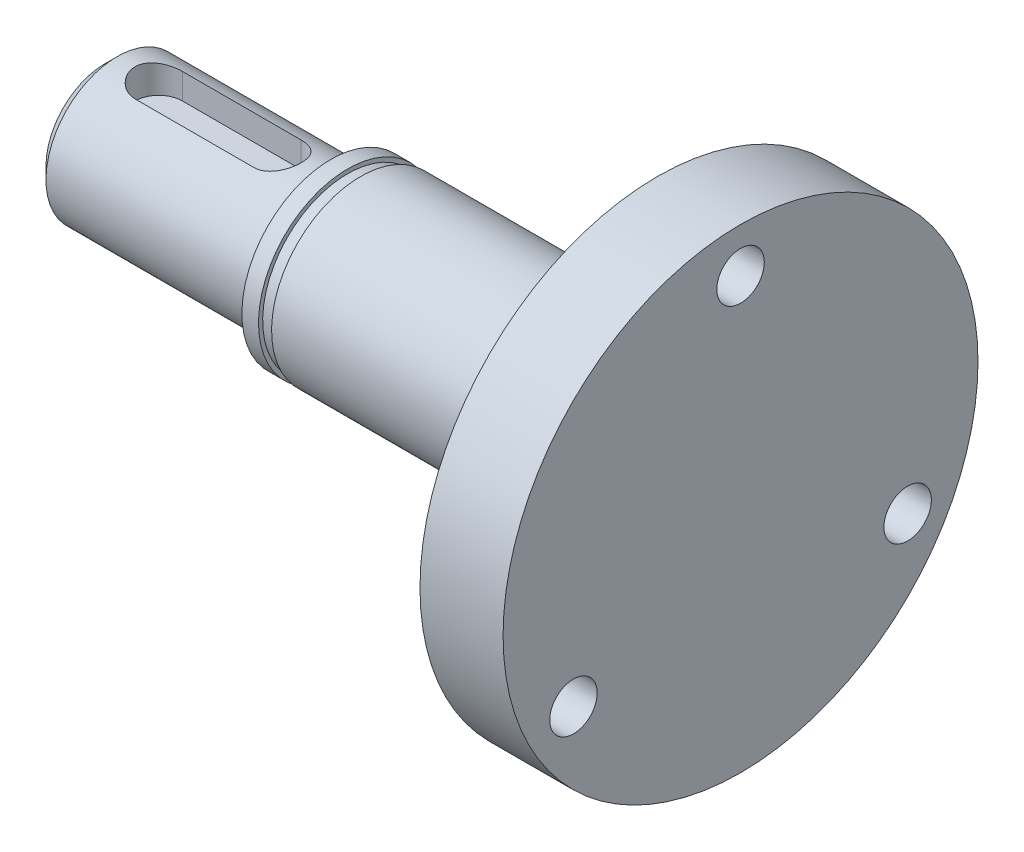
ISO-10303-21;
HEADER;
FILE_DESCRIPTION(('STEP AP214'),'2;1');
FILE_NAME('part.step','',(''),(''),'','','');
FILE_SCHEMA(('AUTOMOTIVE_DESIGN { 1 0 10303 214 1 1 1 1 }'));
ENDSEC;
DATA;
#1=APPLICATION_CONTEXT('core data for automotive mechanical design processes');
#2=APPLICATION_PROTOCOL_DEFINITION('international standard','automotive_design',2000,#1);
#3=PRODUCT_CONTEXT('',#1,'mechanical');
#4=PRODUCT('Part','Part','',(#3));
#5=PRODUCT_RELATED_PRODUCT_CATEGORY('part','',(#4));
#6=PRODUCT_DEFINITION_FORMATION('','',#4);
#7=PRODUCT_DEFINITION_CONTEXT('part definition',#1,'design');
#8=PRODUCT_DEFINITION('design','',#6,#7);
#9=PRODUCT_DEFINITION_SHAPE('','',#8);
#10=(LENGTH_UNIT() NAMED_UNIT(*) SI_UNIT(.MILLI.,.METRE.));
#11=(NAMED_UNIT(*) PLANE_ANGLE_UNIT() SI_UNIT($,.RADIAN.));
#12=(NAMED_UNIT(*) SI_UNIT($,.STERADIAN.) SOLID_ANGLE_UNIT());
#13=UNCERTAINTY_MEASURE_WITH_UNIT(LENGTH_MEASURE(1.E-05),#10,'distance_accuracy_value','');
#14=(GEOMETRIC_REPRESENTATION_CONTEXT(3) GLOBAL_UNCERTAINTY_ASSIGNED_CONTEXT((#13)) GLOBAL_UNIT_ASSIGNED_CONTEXT((#10,
#11,#12)) REPRESENTATION_CONTEXT('',''));
#15=CARTESIAN_POINT('',(0.,0.,0.));
#16=DIRECTION('',(0.,0.,1.));
#17=DIRECTION('',(1.,0.,0.));
#18=AXIS2_PLACEMENT_3D('',#15,#16,#17);
#19=CARTESIAN_POINT('',(20.1719339630271,-0.0191340125355696,1.22493964690422E-07));
#20=DIRECTION('',(1.,0.,0.));
#21=DIRECTION('',(0.,1.,0.));
#22=AXIS2_PLACEMENT_3D('',#19,#20,#21);
#23=CONICAL_SURFACE('',#22,3.,0.785398163397448);
#24=CARTESIAN_POINT('',(19.6719339630271,-0.0191340125355699,1.22493964690422E-07));
#25=DIRECTION('',(-1.,0.,0.));
#26=DIRECTION('',(0.,-1.,0.));
#27=AXIS2_PLACEMENT_3D('',#24,#25,#26);
#28=CIRCLE('',#27,2.5);
#29=CARTESIAN_POINT('',(19.6719339630271,-2.51913401253557,1.22493964690422E-07));
#30=VERTEX_POINT('',#29);
#31=EDGE_CURVE('E123',#30,#30,#28,.T.);
#32=ORIENTED_EDGE('',*,*,#31,.F.);
#33=EDGE_LOOP('',(#32));
#34=FACE_BOUND('',#33,.T.);
#35=CARTESIAN_POINT('',(20.1719339630271,-0.0191340125355696,1.22493964690422E-07));
#36=DIRECTION('',(-1.,0.,0.));
#37=DIRECTION('',(0.,-1.,0.));
#38=AXIS2_PLACEMENT_3D('',#35,#36,#37);
#39=CIRCLE('',#38,3.);
#40=CARTESIAN_POINT('',(20.1719339630271,-3.01913401253557,1.22493964690422E-07));
#41=VERTEX_POINT('',#40);
#42=EDGE_CURVE('E159',#41,#41,#39,.T.);
#43=ORIENTED_EDGE('',*,*,#42,.T.);
#44=EDGE_LOOP('',(#43));
#45=FACE_BOUND('',#44,.T.);
#46=ADVANCED_FACE('F37',(#34,#45),#23,.T.);
#47=CARTESIAN_POINT('',(19.6719339630271,-0.0191340125355699,1.22493964690422E-07));
#48=DIRECTION('',(-1.,0.,0.));
#49=DIRECTION('',(0.,-1.,0.));
#50=AXIS2_PLACEMENT_3D('',#47,#48,#49);
#51=CYLINDRICAL_SURFACE('',#50,3.00000000000001);
#52=DIRECTION('',(-1.,0.,0.));
#53=VECTOR('',#52,1.);
#54=CARTESIAN_POINT('',(19.6719339630271,2.80929311221063,-0.999999877506035));
#55=LINE('',#54,#53);
#56=CARTESIAN_POINT('',(21.9219339630271,2.80929311221063,-0.999999877506035));
#57=VERTEX_POINT('',#56);
#58=CARTESIAN_POINT('',(26.9219339630271,2.80929311221063,-0.999999877506035));
#59=VERTEX_POINT('',#58);
#60=EDGE_CURVE('E11',#57,#59,#55,.F.);
#61=ORIENTED_EDGE('',*,*,#60,.T.);
#62=CARTESIAN_POINT('',(26.9219339630271,2.80929311221063,-0.999999877506035));
#63=CARTESIAN_POINT('',(26.9492244598282,2.80929040840783,-1.00000062496523));
#64=CARTESIAN_POINT('',(26.9765010252165,2.80968858689689,-0.998882002093428));
#65=CARTESIAN_POINT('',(27.030842547082,2.81125926035665,-0.994425484542437));
#66=CARTESIAN_POINT('',(27.0579075586868,2.81243154630566,-0.99108818893956));
#67=CARTESIAN_POINT('',(27.1383261062223,2.81705690971095,-0.977810552736824));
#68=CARTESIAN_POINT('',(27.1911148092976,2.82161891245959,-0.964604110534149));
#69=CARTESIAN_POINT('',(27.2935591554709,2.83314673445303,-0.929958289336464));
#70=CARTESIAN_POINT('',(27.3432165099001,2.84011122699373,-0.908523453493571));
#71=CARTESIAN_POINT('',(27.4382737970326,2.85565385965905,-0.858073106470907));
#72=CARTESIAN_POINT('',(27.4836710920945,2.86423298974552,-0.829052940328772));
#73=CARTESIAN_POINT('',(27.5706541943517,2.88241079148492,-0.763051271029047));
#74=CARTESIAN_POINT('',(27.6120488434897,2.89203476514753,-0.725824857828071));
#75=CARTESIAN_POINT('',(27.6881399808188,2.91100447439422,-0.644988320497518));
#76=CARTESIAN_POINT('',(27.7228352762831,2.92035016018297,-0.601377062060571));
#77=CARTESIAN_POINT('',(27.7854134818313,2.93800481740671,-0.507603523462299));
#78=CARTESIAN_POINT('',(27.8130949474294,2.94628036308298,-0.457299966864533));
#79=CARTESIAN_POINT('',(27.8595262147144,2.96056207351102,-0.352429127471895));
#80=CARTESIAN_POINT('',(27.8782787448476,2.96656893139754,-0.297863153099455));
#81=CARTESIAN_POINT('',(27.9056696891185,2.97545669889367,-0.188029222984071));
#82=CARTESIAN_POINT('',(27.9146372355808,2.97843907735017,-0.132851711966147));
#83=CARTESIAN_POINT('',(27.9232502615527,2.98130207150261,-0.0216988469617084));
#84=CARTESIAN_POINT('',(27.9228979622969,2.98118342627746,0.034276313739357));
#85=CARTESIAN_POINT('',(27.9130896799205,2.9779263738171,0.143103967773357));
#86=CARTESIAN_POINT('',(27.9039913250677,2.97490659737708,0.195992825119502));
#87=CARTESIAN_POINT('',(27.877540764353,2.96633559247268,0.299444186870621));
#88=CARTESIAN_POINT('',(27.8601881008209,2.96078422364175,0.350006562110429));
#89=CARTESIAN_POINT('',(27.8175125934265,2.94762267017748,0.448152745524927));
#90=CARTESIAN_POINT('',(27.7920879179048,2.93998636584757,0.495688628147958));
#91=CARTESIAN_POINT('',(27.7340740116364,2.92344986426488,0.585924711591454));
#92=CARTESIAN_POINT('',(27.7014828319806,2.91454932344037,0.628623592208649));
#93=CARTESIAN_POINT('',(27.6282629130303,2.89592870689184,0.710097462205177));
#94=CARTESIAN_POINT('',(27.5873284194174,2.88618977426358,0.748593734106664));
#95=CARTESIAN_POINT('',(27.499492473311,2.86734089219295,0.818272147314349));
#96=CARTESIAN_POINT('',(27.4525891006239,2.85823114662197,0.849451925677778));
#97=CARTESIAN_POINT('',(27.3532537846738,2.84156630122762,0.904003448086748));
#98=CARTESIAN_POINT('',(27.3007504480942,2.83403613694679,0.927253132001648));
#99=CARTESIAN_POINT('',(27.1922869854372,2.82167695808483,0.964460353195081));
#100=CARTESIAN_POINT('',(27.136332469655,2.81684368155437,0.978432558549321));
#101=CARTESIAN_POINT('',(27.0535153262792,2.81223140841164,0.991658278774793));
#102=CARTESIAN_POINT('',(27.0272925731729,2.81113266441046,0.99478518374908));
#103=CARTESIAN_POINT('',(26.9746958846273,2.80966302317843,0.998954738565162));
#104=CARTESIAN_POINT('',(26.9483221884827,2.80929118675972,1.00000007788894));
#105=CARTESIAN_POINT('',(26.9219339630271,2.80929311221063,1.00000012249396));
#106=B_SPLINE_CURVE_WITH_KNOTS('',3,(#62,#63,#64,#65,#66,#67,#68,#69,#70,#71,#72,#73,#74,#75,
#76,#77,#78,#79,#80,#81,#82,#83,#84,#85,#86,#87,#88,#89,#90,#91,#92,#93,#94,#95,#96,#97,#98,#99,
#100,#101,#102,#103,#104,#105),.UNSPECIFIED.,.F.,.F.,(4,2,2,2,2,2,2,2,2,2,2,2,2,2,2,2,2,2,2,2,2,
4),(0.,0.0818184847354335,0.16361488616946,0.326581198395371,0.489457660966233,
0.652434313135308,0.821165049626778,0.989925798637472,1.16309132933101,1.33620391121127,
1.50329470727403,1.67034568030642,1.83084418465735,1.99135158908248,2.15397018825968,
2.31663306588769,2.4869405405805,2.65730294249242,2.8301802992804,3.00278367486839,
3.08199895332751,3.16111181529056),.UNSPECIFIED.);
#107=CARTESIAN_POINT('',(26.9219339630271,2.80929311221063,1.00000012249396));
#108=VERTEX_POINT('',#107);
#109=EDGE_CURVE('E162',#59,#108,#106,.T.);
#110=ORIENTED_EDGE('',*,*,#109,.T.);
#111=DIRECTION('',(-1.,0.,0.));
#112=VECTOR('',#111,1.);
#113=CARTESIAN_POINT('',(19.6719339630271,2.80929311221063,1.00000012249396));
#114=LINE('',#113,#112);
#115=CARTESIAN_POINT('',(21.9219339630271,2.80929311221063,1.00000012249396));
#116=VERTEX_POINT('',#115);
#117=EDGE_CURVE('E44',#108,#116,#114,.T.);
#118=ORIENTED_EDGE('',*,*,#117,.T.);
#119=CARTESIAN_POINT('',(21.9219339630271,2.80929311221063,1.00000012249396));
#120=CARTESIAN_POINT('',(21.894643466226,2.80929040840783,1.00000086995316));
#121=CARTESIAN_POINT('',(21.8673669008378,2.80968858689689,0.998882247081357));
#122=CARTESIAN_POINT('',(21.8130253789722,2.81125926035665,0.994425729530367));
#123=CARTESIAN_POINT('',(21.7859603673674,2.81243154630566,0.991088433927489));
#124=CARTESIAN_POINT('',(21.705541819832,2.81705690971095,0.977810797724753));
#125=CARTESIAN_POINT('',(21.6527531167567,2.82161891245959,0.964604355522079));
#126=CARTESIAN_POINT('',(21.5503087705834,2.83314673445303,0.929958534324393));
#127=CARTESIAN_POINT('',(21.5006514161542,2.84011122699373,0.908523698481499));
#128=CARTESIAN_POINT('',(21.4055941290217,2.85565385965904,0.858073351458835));
#129=CARTESIAN_POINT('',(21.3601968339598,2.86423298974552,0.829053185316701));
#130=CARTESIAN_POINT('',(21.2732137317026,2.88241079148491,0.763051516016977));
#131=CARTESIAN_POINT('',(21.2318190825645,2.89203476514753,0.725825102816001));
#132=CARTESIAN_POINT('',(21.1557279452354,2.91100447439422,0.644988565485447));
#133=CARTESIAN_POINT('',(21.1210326497712,2.92035016018297,0.601377307048501));
#134=CARTESIAN_POINT('',(21.0584544442229,2.93800481740671,0.507603768450228));
#135=CARTESIAN_POINT('',(21.0307729786249,2.94628036308298,0.457300211852461));
#136=CARTESIAN_POINT('',(20.9843417113399,2.96056207351102,0.352429372459823));
#137=CARTESIAN_POINT('',(20.9655891812067,2.96656893139753,0.297863398087384));
#138=CARTESIAN_POINT('',(20.9381982369358,2.97545669889366,0.188029467972001));
#139=CARTESIAN_POINT('',(20.9292306904734,2.97843907735017,0.132851956954076));
#140=CARTESIAN_POINT('',(20.9206176645015,2.9813020715026,0.0216990919496373));
#141=CARTESIAN_POINT('',(20.9209699637574,2.98118342627746,-0.0342760687514281));
#142=CARTESIAN_POINT('',(20.9307782461338,2.9779263738171,-0.143103722785428));
#143=CARTESIAN_POINT('',(20.9398766009866,2.97490659737707,-0.195992580131572));
#144=CARTESIAN_POINT('',(20.9663271617013,2.96633559247267,-0.299443941882692));
#145=CARTESIAN_POINT('',(20.9836798252334,2.96078422364175,-0.3500063171225));
#146=CARTESIAN_POINT('',(21.0263553326278,2.94762267017748,-0.448152500536998));
#147=CARTESIAN_POINT('',(21.0517800081495,2.93998636584756,-0.495688383160027));
#148=CARTESIAN_POINT('',(21.1097939144178,2.92344986426488,-0.585924466603523));
#149=CARTESIAN_POINT('',(21.1423850940736,2.91454932344037,-0.62862334722072));
#150=CARTESIAN_POINT('',(21.215605013024,2.89592870689183,-0.710097217217248));
#151=CARTESIAN_POINT('',(21.2565395066368,2.88618977426358,-0.748593489118735));
#152=CARTESIAN_POINT('',(21.3443754527433,2.86734089219295,-0.818271902326419));
#153=CARTESIAN_POINT('',(21.3912788254304,2.85823114662197,-0.849451680689849));
#154=CARTESIAN_POINT('',(21.4906141413804,2.84156630122761,-0.904003203098819));
#155=CARTESIAN_POINT('',(21.5431174779601,2.83403613694678,-0.927252887013719));
#156=CARTESIAN_POINT('',(21.6515809406171,2.82167695808483,-0.964460108207152));
#157=CARTESIAN_POINT('',(21.7075354563993,2.81684368155437,-0.978432313561392));
#158=CARTESIAN_POINT('',(21.7903525997751,2.81223140841164,-0.991658033786864));
#159=CARTESIAN_POINT('',(21.8165753528814,2.81113266441046,-0.994784938761151));
#160=CARTESIAN_POINT('',(21.8691720414269,2.80966302317843,-0.998954493577233));
#161=CARTESIAN_POINT('',(21.8955457375715,2.80929118675972,-0.999999832901014));
#162=CARTESIAN_POINT('',(21.9219339630271,2.80929311221063,-0.999999877506035));
#163=B_SPLINE_CURVE_WITH_KNOTS('',3,(#119,#120,#121,#122,#123,#124,#125,#126,#127,#128,#129,
#130,#131,#132,#133,#134,#135,#136,#137,#138,#139,#140,#141,#142,#143,#144,#145,#146,#147,#148,
#149,#150,#151,#152,#153,#154,#155,#156,#157,#158,#159,#160,#161,#162),.UNSPECIFIED.,.F.,.F.,(4,
2,2,2,2,2,2,2,2,2,2,2,2,2,2,2,2,2,2,2,2,4),(0.,0.0818184847354301,0.163614886169459,
0.326581198395374,0.489457660966237,0.652434313135309,0.821165049626774,0.989925798637475,
1.16309132933101,1.33620391121127,1.50329470727403,1.67034568030642,1.83084418465735,
1.99135158908248,2.15397018825968,2.31663306588769,2.4869405405805,2.65730294249242,
2.8301802992804,3.00278367486839,3.08199895332751,3.16111181529056),.UNSPECIFIED.);
#164=EDGE_CURVE('E51',#116,#57,#163,.T.);
#165=ORIENTED_EDGE('',*,*,#164,.T.);
#166=EDGE_LOOP('',(#61,#110,#118,#165));
#167=FACE_BOUND('',#166,.T.);
#168=ORIENTED_EDGE('',*,*,#42,.F.);
#169=EDGE_LOOP('',(#168));
#170=FACE_BOUND('',#169,.T.);
#171=CARTESIAN_POINT('',(29.1719339630271,-0.019134012535565,1.22493964690422E-07));
#172=DIRECTION('',(-1.,0.,0.));
#173=DIRECTION('',(0.,-1.,0.));
#174=AXIS2_PLACEMENT_3D('',#171,#172,#173);
#175=CIRCLE('',#174,3.00000000000001);
#176=CARTESIAN_POINT('',(29.1719339630271,-3.01913401253558,1.22493964690422E-07));
#177=VERTEX_POINT('',#176);
#178=EDGE_CURVE('E156',#177,#177,#175,.T.);
#179=ORIENTED_EDGE('',*,*,#178,.T.);
#180=EDGE_LOOP('',(#179));
#181=FACE_BOUND('',#180,.T.);
#182=ADVANCED_FACE('F175',(#167,#170,#181),#51,.T.);
#183=CARTESIAN_POINT('',(29.1719339630271,2.98086598746445,1.22493964690422E-07));
#184=DIRECTION('',(1.,0.,0.));
#185=DIRECTION('',(0.,1.,0.));
#186=AXIS2_PLACEMENT_3D('',#183,#184,#185);
#187=PLANE('',#186);
#188=ORIENTED_EDGE('',*,*,#178,.F.);
#189=EDGE_LOOP('',(#188));
#190=FACE_BOUND('',#189,.T.);
#191=CARTESIAN_POINT('',(29.1719339630271,-0.019134012535565,1.22493964690422E-07));
#192=DIRECTION('',(-1.,0.,0.));
#193=DIRECTION('',(0.,-1.,0.));
#194=AXIS2_PLACEMENT_3D('',#191,#192,#193);
#195=CIRCLE('',#194,3.75);
#196=CARTESIAN_POINT('',(29.1719339630271,-3.76913401253556,1.22493964690422E-07));
#197=VERTEX_POINT('',#196);
#198=EDGE_CURVE('E153',#197,#197,#195,.T.);
#199=ORIENTED_EDGE('',*,*,#198,.T.);
#200=EDGE_LOOP('',(#199));
#201=FACE_BOUND('',#200,.T.);
#202=ADVANCED_FACE('F244',(#190,#201),#187,.F.);
#203=CARTESIAN_POINT('',(19.6719339630271,-0.0191340125355699,1.22493964690422E-07));
#204=DIRECTION('',(-1.,0.,0.));
#205=DIRECTION('',(0.,-1.,0.));
#206=AXIS2_PLACEMENT_3D('',#203,#204,#205);
#207=CYLINDRICAL_SURFACE('',#206,3.75);
#208=ORIENTED_EDGE('',*,*,#198,.F.);
#209=EDGE_LOOP('',(#208));
#210=FACE_BOUND('',#209,.T.);
#211=CARTESIAN_POINT('',(29.8719339630271,-0.0191340125355646,1.22493964690422E-07));
#212=DIRECTION('',(-1.,0.,0.));
#213=DIRECTION('',(0.,-1.,0.));
#214=AXIS2_PLACEMENT_3D('',#211,#212,#213);
#215=CIRCLE('',#214,3.75000000000001);
#216=CARTESIAN_POINT('',(29.8719339630271,-3.76913401253558,1.22493964690422E-07));
#217=VERTEX_POINT('',#216);
#218=EDGE_CURVE('E150',#217,#217,#215,.T.);
#219=ORIENTED_EDGE('',*,*,#218,.T.);
#220=EDGE_LOOP('',(#219));
#221=FACE_BOUND('',#220,.T.);
#222=ADVANCED_FACE('F241',(#210,#221),#207,.T.);
#223=CARTESIAN_POINT('',(29.8719339630271,3.55586598746445,1.22493964690422E-07));
#224=DIRECTION('',(-1.,0.,0.));
#225=DIRECTION('',(0.,-1.,0.));
#226=AXIS2_PLACEMENT_3D('',#223,#224,#225);
#227=PLANE('',#226);
#228=ORIENTED_EDGE('',*,*,#218,.F.);
#229=EDGE_LOOP('',(#228));
#230=FACE_BOUND('',#229,.T.);
#231=CARTESIAN_POINT('',(29.8719339630271,-0.0191340125355646,1.22493964690422E-07));
#232=DIRECTION('',(-1.,0.,0.));
#233=DIRECTION('',(0.,-1.,0.));
#234=AXIS2_PLACEMENT_3D('',#231,#232,#233);
#235=CIRCLE('',#234,3.57500000000002);
#236=CARTESIAN_POINT('',(29.8719339630271,-3.59413401253558,1.22493964690422E-07));
#237=VERTEX_POINT('',#236);
#238=EDGE_CURVE('E147',#237,#237,#235,.T.);
#239=ORIENTED_EDGE('',*,*,#238,.T.);
#240=EDGE_LOOP('',(#239));
#241=FACE_BOUND('',#240,.T.);
#242=ADVANCED_FACE('F237',(#230,#241),#227,.F.);
#243=CARTESIAN_POINT('',(19.6719339630271,-0.0191340125355699,1.22493964690422E-07));
#244=DIRECTION('',(-1.,0.,0.));
#245=DIRECTION('',(0.,-1.,0.));
#246=AXIS2_PLACEMENT_3D('',#243,#244,#245);
#247=CYLINDRICAL_SURFACE('',#246,3.57500000000002);
#248=ORIENTED_EDGE('',*,*,#238,.F.);
#249=EDGE_LOOP('',(#248));
#250=FACE_BOUND('',#249,.T.);
#251=CARTESIAN_POINT('',(30.4219339630272,-0.0191340125355643,1.22493964690422E-07));
#252=DIRECTION('',(-1.,0.,0.));
#253=DIRECTION('',(0.,-1.,0.));
#254=AXIS2_PLACEMENT_3D('',#251,#252,#253);
#255=CIRCLE('',#254,3.57500000000003);
#256=CARTESIAN_POINT('',(30.4219339630272,-3.5941340125356,1.22493964690422E-07));
#257=VERTEX_POINT('',#256);
#258=EDGE_CURVE('E144',#257,#257,#255,.T.);
#259=ORIENTED_EDGE('',*,*,#258,.T.);
#260=EDGE_LOOP('',(#259));
#261=FACE_BOUND('',#260,.T.);
#262=ADVANCED_FACE('F233',(#250,#261),#247,.T.);
#263=CARTESIAN_POINT('',(30.4219339630271,3.55586598746447,1.22493964690422E-07));
#264=DIRECTION('',(1.,0.,0.));
#265=DIRECTION('',(0.,1.,0.));
#266=AXIS2_PLACEMENT_3D('',#263,#264,#265);
#267=PLANE('',#266);
#268=ORIENTED_EDGE('',*,*,#258,.F.);
#269=EDGE_LOOP('',(#268));
#270=FACE_BOUND('',#269,.T.);
#271=CARTESIAN_POINT('',(30.4219339630271,-0.0191340125355643,1.22493964690422E-07));
#272=DIRECTION('',(-1.,0.,0.));
#273=DIRECTION('',(0.,-1.,0.));
#274=AXIS2_PLACEMENT_3D('',#271,#272,#273);
#275=CIRCLE('',#274,3.75);
#276=CARTESIAN_POINT('',(30.4219339630271,-3.76913401253556,1.22493964690422E-07));
#277=VERTEX_POINT('',#276);
#278=EDGE_CURVE('E141',#277,#277,#275,.T.);
#279=ORIENTED_EDGE('',*,*,#278,.T.);
#280=EDGE_LOOP('',(#279));
#281=FACE_BOUND('',#280,.T.);
#282=ADVANCED_FACE('F229',(#270,#281),#267,.F.);
#283=CARTESIAN_POINT('',(19.6719339630271,-0.0191340125355699,1.22493964690422E-07));
#284=DIRECTION('',(-1.,0.,0.));
#285=DIRECTION('',(0.,-1.,0.));
#286=AXIS2_PLACEMENT_3D('',#283,#284,#285);
#287=CYLINDRICAL_SURFACE('',#286,3.74999999999998);
#288=ORIENTED_EDGE('',*,*,#278,.F.);
#289=EDGE_LOOP('',(#288));
#290=FACE_BOUND('',#289,.T.);
#291=CARTESIAN_POINT('',(42.6719339630271,-0.019134012535558,1.22493964690422E-07));
#292=DIRECTION('',(-1.,0.,0.));
#293=DIRECTION('',(0.,-1.,0.));
#294=AXIS2_PLACEMENT_3D('',#291,#292,#293);
#295=CIRCLE('',#294,3.74999999999996);
#296=CARTESIAN_POINT('',(42.6719339630271,-3.76913401253552,1.22493964690422E-07));
#297=VERTEX_POINT('',#296);
#298=EDGE_CURVE('E138',#297,#297,#295,.T.);
#299=ORIENTED_EDGE('',*,*,#298,.T.);
#300=EDGE_LOOP('',(#299));
#301=FACE_BOUND('',#300,.T.);
#302=ADVANCED_FACE('F225',(#290,#301),#287,.T.);
#303=CARTESIAN_POINT('',(42.6719339630271,3.73086598746441,1.22493964690422E-07));
#304=DIRECTION('',(1.,0.,0.));
#305=DIRECTION('',(0.,1.,0.));
#306=AXIS2_PLACEMENT_3D('',#303,#304,#305);
#307=PLANE('',#306);
#308=ORIENTED_EDGE('',*,*,#298,.F.);
#309=EDGE_LOOP('',(#308));
#310=FACE_BOUND('',#309,.T.);
#311=CARTESIAN_POINT('',(42.6719339630271,-0.019134012535558,1.22493964690422E-07));
#312=DIRECTION('',(-1.,0.,0.));
#313=DIRECTION('',(0.,-1.,0.));
#314=AXIS2_PLACEMENT_3D('',#311,#312,#313);
#315=CIRCLE('',#314,5.00000000000001);
#316=CARTESIAN_POINT('',(42.6719339630271,-5.01913401253556,1.22493964690422E-07));
#317=VERTEX_POINT('',#316);
#318=EDGE_CURVE('E135',#317,#317,#315,.T.);
#319=ORIENTED_EDGE('',*,*,#318,.T.);
#320=EDGE_LOOP('',(#319));
#321=FACE_BOUND('',#320,.T.);
#322=ADVANCED_FACE('F221',(#310,#321),#307,.F.);
#323=CARTESIAN_POINT('',(19.6719339630271,-0.0191340125355699,1.22493964690422E-07));
#324=DIRECTION('',(-1.,0.,0.));
#325=DIRECTION('',(0.,-1.,0.));
#326=AXIS2_PLACEMENT_3D('',#323,#324,#325);
#327=CYLINDRICAL_SURFACE('',#326,5.00000000000001);
#328=ORIENTED_EDGE('',*,*,#318,.F.);
#329=EDGE_LOOP('',(#328));
#330=FACE_BOUND('',#329,.T.);
#331=CARTESIAN_POINT('',(42.9219339630271,-0.0191340125355578,1.22493964690422E-07));
#332=DIRECTION('',(-1.,0.,0.));
#333=DIRECTION('',(0.,-1.,0.));
#334=AXIS2_PLACEMENT_3D('',#331,#332,#333);
#335=CIRCLE('',#334,5.00000000000002);
#336=CARTESIAN_POINT('',(42.9219339630271,-5.01913401253558,1.22493964690422E-07));
#337=VERTEX_POINT('',#336);
#338=EDGE_CURVE('E132',#337,#337,#335,.T.);
#339=ORIENTED_EDGE('',*,*,#338,.T.);
#340=EDGE_LOOP('',(#339));
#341=FACE_BOUND('',#340,.T.);
#342=ADVANCED_FACE('F217',(#330,#341),#327,.T.);
#343=CARTESIAN_POINT('',(42.9219339630271,4.98086598746446,1.22493964690422E-07));
#344=DIRECTION('',(1.,0.,0.));
#345=DIRECTION('',(0.,1.,0.));
#346=AXIS2_PLACEMENT_3D('',#343,#344,#345);
#347=PLANE('',#346);
#348=CARTESIAN_POINT('',(42.9219339630271,-4.08163401253549,7.03645652824257));
#349=DIRECTION('',(1.,0.,0.));
#350=DIRECTION('',(0.,1.,0.));
#351=AXIS2_PLACEMENT_3D('',#348,#349,#350);
#352=CIRCLE('',#351,0.999999999999999);
#353=CARTESIAN_POINT('',(42.9219339630271,-3.08163401253549,7.03645652824257));
#354=VERTEX_POINT('',#353);
#355=EDGE_CURVE('E108',#354,#354,#352,.T.);
#356=ORIENTED_EDGE('',*,*,#355,.T.);
#357=EDGE_LOOP('',(#356));
#358=FACE_BOUND('',#357,.T.);
#359=CARTESIAN_POINT('',(42.9219339630271,-4.08163401253559,-7.03645628325458));
#360=DIRECTION('',(1.,0.,0.));
#361=DIRECTION('',(0.,1.,0.));
#362=AXIS2_PLACEMENT_3D('',#359,#360,#361);
#363=CIRCLE('',#362,0.999999999999999);
#364=CARTESIAN_POINT('',(42.9219339630271,-3.08163401253559,-7.03645628325458));
#365=VERTEX_POINT('',#364);
#366=EDGE_CURVE('E114',#365,#365,#363,.T.);
#367=ORIENTED_EDGE('',*,*,#366,.T.);
#368=EDGE_LOOP('',(#367));
#369=FACE_BOUND('',#368,.T.);
#370=CARTESIAN_POINT('',(42.9219339630271,8.10586598746444,1.22493964690422E-07));
#371=DIRECTION('',(1.,0.,0.));
#372=DIRECTION('',(0.,1.,0.));
#373=AXIS2_PLACEMENT_3D('',#370,#371,#372);
#374=CIRCLE('',#373,0.999999999999999);
#375=CARTESIAN_POINT('',(42.9219339630271,9.10586598746444,1.22493964690422E-07));
#376=VERTEX_POINT('',#375);
#377=EDGE_CURVE('E120',#376,#376,#374,.T.);
#378=ORIENTED_EDGE('',*,*,#377,.T.);
#379=EDGE_LOOP('',(#378));
#380=FACE_BOUND('',#379,.T.);
#381=ORIENTED_EDGE('',*,*,#338,.F.);
#382=EDGE_LOOP('',(#381));
#383=FACE_BOUND('',#382,.T.);
#384=CARTESIAN_POINT('',(42.9219339630271,-0.0191340125355578,1.22493964690422E-07));
#385=DIRECTION('',(-1.,0.,0.));
#386=DIRECTION('',(0.,-1.,0.));
#387=AXIS2_PLACEMENT_3D('',#384,#385,#386);
#388=CIRCLE('',#387,10.);
#389=CARTESIAN_POINT('',(42.9219339630271,-10.0191340125356,1.22493964690422E-07));
#390=VERTEX_POINT('',#389);
#391=EDGE_CURVE('E129',#390,#390,#388,.T.);
#392=ORIENTED_EDGE('',*,*,#391,.T.);
#393=EDGE_LOOP('',(#392));
#394=FACE_BOUND('',#393,.T.);
#395=ADVANCED_FACE('F213',(#358,#369,#380,#383,#394),#347,.F.);
#396=CARTESIAN_POINT('',(19.6719339630271,-0.0191340125355699,1.22493964690422E-07));
#397=DIRECTION('',(-1.,0.,0.));
#398=DIRECTION('',(0.,-1.,0.));
#399=AXIS2_PLACEMENT_3D('',#396,#397,#398);
#400=CYLINDRICAL_SURFACE('',#399,10.);
#401=ORIENTED_EDGE('',*,*,#391,.F.);
#402=EDGE_LOOP('',(#401));
#403=FACE_BOUND('',#402,.T.);
#404=CARTESIAN_POINT('',(46.4219339630271,-0.019134012535556,1.22493964690422E-07));
#405=DIRECTION('',(-1.,0.,0.));
#406=DIRECTION('',(0.,-1.,0.));
#407=AXIS2_PLACEMENT_3D('',#404,#405,#406);
#408=CIRCLE('',#407,10.);
#409=CARTESIAN_POINT('',(46.4219339630272,-10.0191340125356,1.22493964690422E-07));
#410=VERTEX_POINT('',#409);
#411=EDGE_CURVE('E126',#410,#410,#408,.T.);
#412=ORIENTED_EDGE('',*,*,#411,.T.);
#413=EDGE_LOOP('',(#412));
#414=FACE_BOUND('',#413,.T.);
#415=ADVANCED_FACE('F209',(#403,#414),#400,.T.);
#416=CARTESIAN_POINT('',(46.4219339630271,-0.019134012535556,1.22493964690422E-07));
#417=DIRECTION('',(-1.,0.,0.));
#418=DIRECTION('',(0.,-1.,0.));
#419=AXIS2_PLACEMENT_3D('',#416,#417,#418);
#420=PLANE('',#419);
#421=CARTESIAN_POINT('',(46.4219339630271,-4.08163401253549,7.03645652824257));
#422=DIRECTION('',(1.,0.,0.));
#423=DIRECTION('',(0.,0.,-1.));
#424=AXIS2_PLACEMENT_3D('',#421,#422,#423);
#425=CIRCLE('',#424,1.);
#426=CARTESIAN_POINT('',(46.4219339630271,-4.08163401253549,6.03645652824257));
#427=VERTEX_POINT('',#426);
#428=EDGE_CURVE('E102',#427,#427,#425,.T.);
#429=ORIENTED_EDGE('',*,*,#428,.F.);
#430=EDGE_LOOP('',(#429));
#431=FACE_BOUND('',#430,.T.);
#432=CARTESIAN_POINT('',(46.4219339630271,-4.08163401253559,-7.03645628325458));
#433=DIRECTION('',(1.,0.,0.));
#434=DIRECTION('',(0.,0.,-1.));
#435=AXIS2_PLACEMENT_3D('',#432,#433,#434);
#436=CIRCLE('',#435,1.);
#437=CARTESIAN_POINT('',(46.4219339630271,-4.08163401253559,-8.03645628325458));
#438=VERTEX_POINT('',#437);
#439=EDGE_CURVE('E111',#438,#438,#436,.T.);
#440=ORIENTED_EDGE('',*,*,#439,.F.);
#441=EDGE_LOOP('',(#440));
#442=FACE_BOUND('',#441,.T.);
#443=CARTESIAN_POINT('',(46.4219339630271,8.10586598746444,1.22493964690422E-07));
#444=DIRECTION('',(1.,0.,0.));
#445=DIRECTION('',(0.,0.,-1.));
#446=AXIS2_PLACEMENT_3D('',#443,#444,#445);
#447=CIRCLE('',#446,0.999999999999999);
#448=CARTESIAN_POINT('',(46.4219339630271,8.10586598746444,-0.999999877506035));
#449=VERTEX_POINT('',#448);
#450=EDGE_CURVE('E117',#449,#449,#447,.T.);
#451=ORIENTED_EDGE('',*,*,#450,.F.);
#452=EDGE_LOOP('',(#451));
#453=FACE_BOUND('',#452,.T.);
#454=ORIENTED_EDGE('',*,*,#411,.F.);
#455=EDGE_LOOP('',(#454));
#456=FACE_BOUND('',#455,.T.);
#457=ADVANCED_FACE('F205',(#431,#442,#453,#456),#420,.F.);
#458=CARTESIAN_POINT('',(19.6719339630271,-0.0191340125355699,1.22493964690422E-07));
#459=DIRECTION('',(1.,0.,0.));
#460=DIRECTION('',(0.,1.,0.));
#461=AXIS2_PLACEMENT_3D('',#458,#459,#460);
#462=PLANE('',#461);
#463=ORIENTED_EDGE('',*,*,#31,.T.);
#464=EDGE_LOOP('',(#463));
#465=FACE_BOUND('',#464,.T.);
#466=ADVANCED_FACE('F201',(#465),#462,.F.);
#467=CARTESIAN_POINT('',(46.4219339630271,8.10586598746444,1.22493964690422E-07));
#468=DIRECTION('',(1.,0.,0.));
#469=DIRECTION('',(0.,0.,-1.));
#470=AXIS2_PLACEMENT_3D('',#467,#468,#469);
#471=CYLINDRICAL_SURFACE('',#470,0.999999999999999);
#472=ORIENTED_EDGE('',*,*,#450,.T.);
#473=EDGE_LOOP('',(#472));
#474=FACE_BOUND('',#473,.T.);
#475=ORIENTED_EDGE('',*,*,#377,.F.);
#476=EDGE_LOOP('',(#475));
#477=FACE_BOUND('',#476,.T.);
#478=ADVANCED_FACE('F197',(#474,#477),#471,.F.);
#479=CARTESIAN_POINT('',(46.4219339630271,-4.08163401253559,-7.03645628325458));
#480=DIRECTION('',(1.,0.,0.));
#481=DIRECTION('',(0.,0.,-1.));
#482=AXIS2_PLACEMENT_3D('',#479,#480,#481);
#483=CYLINDRICAL_SURFACE('',#482,0.999999999999999);
#484=ORIENTED_EDGE('',*,*,#439,.T.);
#485=EDGE_LOOP('',(#484));
#486=FACE_BOUND('',#485,.T.);
#487=ORIENTED_EDGE('',*,*,#366,.F.);
#488=EDGE_LOOP('',(#487));
#489=FACE_BOUND('',#488,.T.);
#490=ADVANCED_FACE('F193',(#486,#489),#483,.F.);
#491=CARTESIAN_POINT('',(46.4219339630271,-4.08163401253549,7.03645652824257));
#492=DIRECTION('',(1.,0.,0.));
#493=DIRECTION('',(0.,0.,-1.));
#494=AXIS2_PLACEMENT_3D('',#491,#492,#493);
#495=CYLINDRICAL_SURFACE('',#494,0.999999999999999);
#496=ORIENTED_EDGE('',*,*,#428,.T.);
#497=EDGE_LOOP('',(#496));
#498=FACE_BOUND('',#497,.T.);
#499=ORIENTED_EDGE('',*,*,#355,.F.);
#500=EDGE_LOOP('',(#499));
#501=FACE_BOUND('',#500,.T.);
#502=ADVANCED_FACE('F190',(#498,#501),#495,.F.);
#503=CARTESIAN_POINT('',(21.9219339630271,1.73086598746443,1.22493964690422E-07));
#504=DIRECTION('',(0.,1.,0.));
#505=DIRECTION('',(0.,0.,1.));
#506=AXIS2_PLACEMENT_3D('',#503,#504,#505);
#507=CYLINDRICAL_SURFACE('',#506,1.);
#508=DIRECTION('',(0.,1.,0.));
#509=VECTOR('',#508,1.);
#510=CARTESIAN_POINT('',(21.9219339630271,1.73086598746443,1.00000012249396));
#511=LINE('',#510,#509);
#512=CARTESIAN_POINT('',(21.9219339630271,1.73086598746443,1.00000012249396));
#513=VERTEX_POINT('',#512);
#514=EDGE_CURVE('E74',#513,#116,#511,.T.);
#515=ORIENTED_EDGE('',*,*,#514,.F.);
#516=CARTESIAN_POINT('',(21.9219339630271,1.73086598746443,1.22493964690422E-07));
#517=DIRECTION('',(0.,1.,0.));
#518=DIRECTION('',(0.,0.,1.));
#519=AXIS2_PLACEMENT_3D('',#516,#517,#518);
#520=CIRCLE('',#519,1.);
#521=CARTESIAN_POINT('',(21.9219339630271,1.73086598746443,-0.999999877506035));
#522=VERTEX_POINT('',#521);
#523=EDGE_CURVE('E78',#522,#513,#520,.T.);
#524=ORIENTED_EDGE('',*,*,#523,.F.);
#525=DIRECTION('',(0.,1.,0.));
#526=VECTOR('',#525,1.);
#527=CARTESIAN_POINT('',(21.9219339630271,1.73086598746443,-0.999999877506035));
#528=LINE('',#527,#526);
#529=EDGE_CURVE('E100',#522,#57,#528,.T.);
#530=ORIENTED_EDGE('',*,*,#529,.T.);
#531=ORIENTED_EDGE('',*,*,#164,.F.);
#532=EDGE_LOOP('',(#515,#524,#530,#531));
#533=FACE_BOUND('',#532,.T.);
#534=ADVANCED_FACE('F76',(#533),#507,.F.);
#535=CARTESIAN_POINT('',(21.9219339630271,1.73086598746443,-0.999999877506035));
#536=DIRECTION('',(0.,0.,-1.));
#537=DIRECTION('',(-1.,0.,0.));
#538=AXIS2_PLACEMENT_3D('',#535,#536,#537);
#539=PLANE('',#538);
#540=ORIENTED_EDGE('',*,*,#529,.F.);
#541=DIRECTION('',(-1.,0.,0.));
#542=VECTOR('',#541,1.);
#543=CARTESIAN_POINT('',(21.9219339630271,1.73086598746443,-0.999999877506035));
#544=LINE('',#543,#542);
#545=CARTESIAN_POINT('',(26.9219339630271,1.73086598746443,-0.999999877506035));
#546=VERTEX_POINT('',#545);
#547=EDGE_CURVE('E83',#546,#522,#544,.T.);
#548=ORIENTED_EDGE('',*,*,#547,.F.);
#549=DIRECTION('',(0.,1.,0.));
#550=VECTOR('',#549,1.);
#551=CARTESIAN_POINT('',(26.9219339630271,1.73086598746443,-0.999999877506035));
#552=LINE('',#551,#550);
#553=EDGE_CURVE('E103',#546,#59,#552,.T.);
#554=ORIENTED_EDGE('',*,*,#553,.T.);
#555=ORIENTED_EDGE('',*,*,#60,.F.);
#556=EDGE_LOOP('',(#540,#548,#554,#555));
#557=FACE_BOUND('',#556,.T.);
#558=ADVANCED_FACE('F183',(#557),#539,.F.);
#559=CARTESIAN_POINT('',(26.9219339630271,1.73086598746443,1.22493964690422E-07));
#560=DIRECTION('',(0.,1.,0.));
#561=DIRECTION('',(0.,0.,1.));
#562=AXIS2_PLACEMENT_3D('',#559,#560,#561);
#563=CYLINDRICAL_SURFACE('',#562,1.);
#564=ORIENTED_EDGE('',*,*,#553,.F.);
#565=CARTESIAN_POINT('',(26.9219339630271,1.73086598746443,1.22493964690422E-07));
#566=DIRECTION('',(0.,1.,0.));
#567=DIRECTION('',(0.,0.,1.));
#568=AXIS2_PLACEMENT_3D('',#565,#566,#567);
#569=CIRCLE('',#568,1.);
#570=CARTESIAN_POINT('',(26.9219339630271,1.73086598746443,1.00000012249396));
#571=VERTEX_POINT('',#570);
#572=EDGE_CURVE('E92',#571,#546,#569,.T.);
#573=ORIENTED_EDGE('',*,*,#572,.F.);
#574=DIRECTION('',(0.,1.,0.));
#575=VECTOR('',#574,1.);
#576=CARTESIAN_POINT('',(26.9219339630271,1.73086598746443,1.00000012249396));
#577=LINE('',#576,#575);
#578=EDGE_CURVE('E82',#571,#108,#577,.T.);
#579=ORIENTED_EDGE('',*,*,#578,.T.);
#580=ORIENTED_EDGE('',*,*,#109,.F.);
#581=EDGE_LOOP('',(#564,#573,#579,#580));
#582=FACE_BOUND('',#581,.T.);
#583=ADVANCED_FACE('F178',(#582),#563,.F.);
#584=CARTESIAN_POINT('',(21.9219339630271,1.73086598746443,1.00000012249396));
#585=DIRECTION('',(0.,0.,1.));
#586=DIRECTION('',(1.,0.,0.));
#587=AXIS2_PLACEMENT_3D('',#584,#585,#586);
#588=PLANE('',#587);
#589=ORIENTED_EDGE('',*,*,#578,.F.);
#590=DIRECTION('',(1.,0.,0.));
#591=VECTOR('',#590,1.);
#592=CARTESIAN_POINT('',(21.9219339630271,1.73086598746443,1.00000012249396));
#593=LINE('',#592,#591);
#594=EDGE_CURVE('E86',#513,#571,#593,.T.);
#595=ORIENTED_EDGE('',*,*,#594,.F.);
#596=ORIENTED_EDGE('',*,*,#514,.T.);
#597=ORIENTED_EDGE('',*,*,#117,.F.);
#598=EDGE_LOOP('',(#589,#595,#596,#597));
#599=FACE_BOUND('',#598,.T.);
#600=ADVANCED_FACE('F87',(#599),#588,.F.);
#601=CARTESIAN_POINT('',(21.9219339630271,1.73086598746443,1.22493964690422E-07));
#602=DIRECTION('',(0.,1.,0.));
#603=DIRECTION('',(0.,0.,1.));
#604=AXIS2_PLACEMENT_3D('',#601,#602,#603);
#605=PLANE('',#604);
#606=ORIENTED_EDGE('',*,*,#523,.T.);
#607=ORIENTED_EDGE('',*,*,#594,.T.);
#608=ORIENTED_EDGE('',*,*,#572,.T.);
#609=ORIENTED_EDGE('',*,*,#547,.T.);
#610=EDGE_LOOP('',(#606,#607,#608,#609));
#611=FACE_BOUND('',#610,.T.);
#612=ADVANCED_FACE('F94',(#611),#605,.T.);
#613=CLOSED_SHELL('',(#46,#182,#202,#222,#242,#262,#282,#302,#322,#342,#395,#415,#457,#466,#478,
#490,#502,#534,#558,#583,#600,#612));
#614=MANIFOLD_SOLID_BREP('B2',#613);
#615=ADVANCED_BREP_SHAPE_REPRESENTATION('',(#18,#614),#14);
#616=SHAPE_DEFINITION_REPRESENTATION(#9,#615);
ENDSEC;
END-ISO-10303-21;
